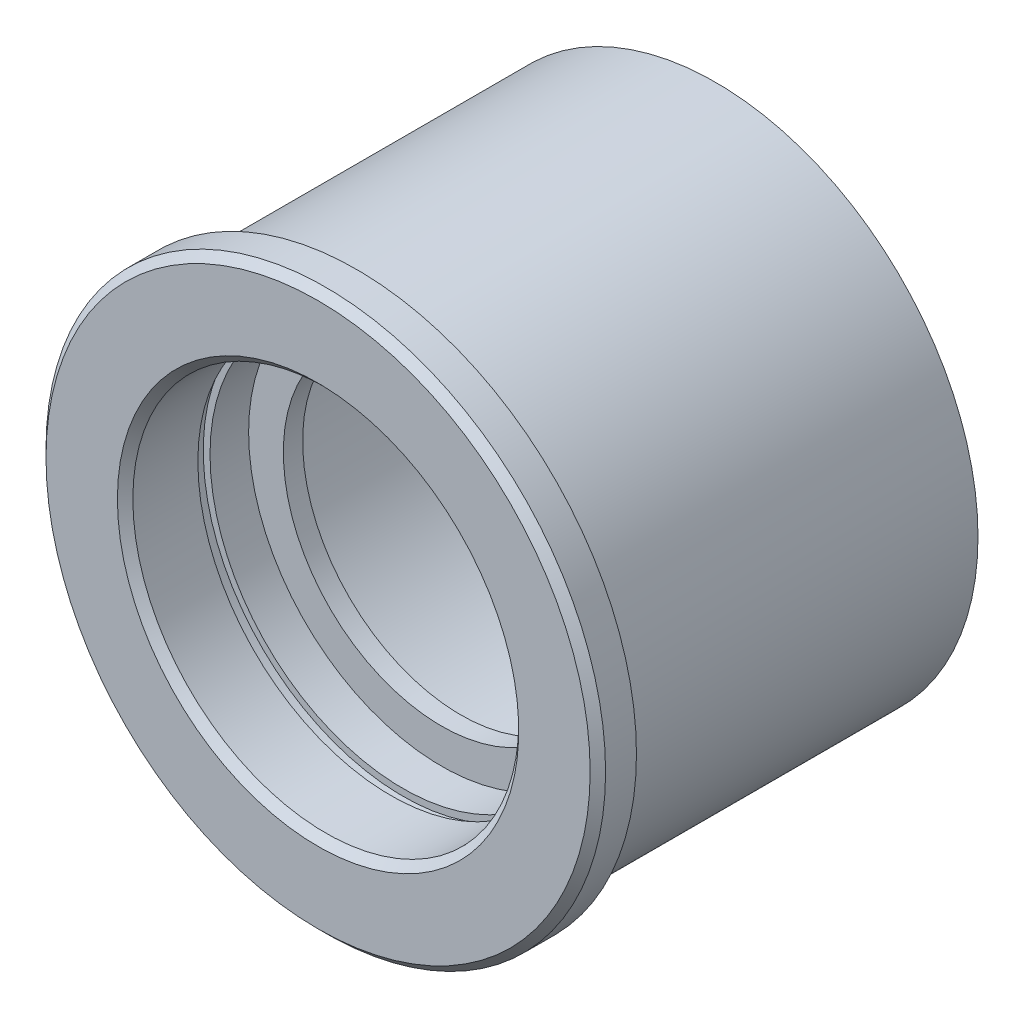
ISO-10303-21;
HEADER;
FILE_DESCRIPTION(('STEP AP214'),'2;1');
FILE_NAME('part.step','',(''),(''),'','','');
FILE_SCHEMA(('AUTOMOTIVE_DESIGN { 1 0 10303 214 1 1 1 1 }'));
ENDSEC;
DATA;
#1=APPLICATION_CONTEXT('core data for automotive mechanical design processes');
#2=APPLICATION_PROTOCOL_DEFINITION('international standard','automotive_design',2000,#1);
#3=PRODUCT_CONTEXT('',#1,'mechanical');
#4=PRODUCT('Part','Part','',(#3));
#5=PRODUCT_RELATED_PRODUCT_CATEGORY('part','',(#4));
#6=PRODUCT_DEFINITION_FORMATION('','',#4);
#7=PRODUCT_DEFINITION_CONTEXT('part definition',#1,'design');
#8=PRODUCT_DEFINITION('design','',#6,#7);
#9=PRODUCT_DEFINITION_SHAPE('','',#8);
#10=(LENGTH_UNIT() NAMED_UNIT(*) SI_UNIT(.MILLI.,.METRE.));
#11=(NAMED_UNIT(*) PLANE_ANGLE_UNIT() SI_UNIT($,.RADIAN.));
#12=(NAMED_UNIT(*) SI_UNIT($,.STERADIAN.) SOLID_ANGLE_UNIT());
#13=UNCERTAINTY_MEASURE_WITH_UNIT(LENGTH_MEASURE(1.E-05),#10,'distance_accuracy_value','');
#14=(GEOMETRIC_REPRESENTATION_CONTEXT(3) GLOBAL_UNCERTAINTY_ASSIGNED_CONTEXT((#13)) GLOBAL_UNIT_ASSIGNED_CONTEXT((#10,
#11,#12)) REPRESENTATION_CONTEXT('',''));
#15=CARTESIAN_POINT('',(0.,0.,0.));
#16=DIRECTION('',(0.,0.,1.));
#17=DIRECTION('',(1.,0.,0.));
#18=AXIS2_PLACEMENT_3D('',#15,#16,#17);
#19=CARTESIAN_POINT('',(0.,72.5,0.));
#20=DIRECTION('',(0.,0.,1.));
#21=DIRECTION('',(1.,0.,0.));
#22=AXIS2_PLACEMENT_3D('',#19,#20,#21);
#23=PLANE('',#22);
#24=CARTESIAN_POINT('',(0.,0.,0.));
#25=DIRECTION('',(0.,0.,1.));
#26=DIRECTION('',(1.,0.,0.));
#27=AXIS2_PLACEMENT_3D('',#24,#25,#26);
#28=CIRCLE('',#27,72.5);
#29=CARTESIAN_POINT('',(72.5,0.,0.));
#30=VERTEX_POINT('',#29);
#31=EDGE_CURVE('E70',#30,#30,#28,.T.);
#32=ORIENTED_EDGE('',*,*,#31,.F.);
#33=EDGE_LOOP('',(#32));
#34=FACE_BOUND('',#33,.T.);
#35=CARTESIAN_POINT('',(0.,0.,0.));
#36=DIRECTION('',(0.,0.,1.));
#37=DIRECTION('',(1.,0.,0.));
#38=AXIS2_PLACEMENT_3D('',#35,#36,#37);
#39=CIRCLE('',#38,68.);
#40=CARTESIAN_POINT('',(68.,0.,0.));
#41=VERTEX_POINT('',#40);
#42=EDGE_CURVE('E118',#41,#41,#39,.T.);
#43=ORIENTED_EDGE('',*,*,#42,.T.);
#44=EDGE_LOOP('',(#43));
#45=FACE_BOUND('',#44,.T.);
#46=ADVANCED_FACE('F43',(#34,#45),#23,.F.);
#47=CARTESIAN_POINT('',(0.,0.,0.));
#48=DIRECTION('',(0.,0.,1.));
#49=DIRECTION('',(1.,0.,0.));
#50=AXIS2_PLACEMENT_3D('',#47,#48,#49);
#51=CYLINDRICAL_SURFACE('',#50,72.5);
#52=CARTESIAN_POINT('',(0.,0.,8.00000000000003));
#53=DIRECTION('',(0.,0.,-1.));
#54=DIRECTION('',(-1.,0.,0.));
#55=AXIS2_PLACEMENT_3D('',#52,#53,#54);
#56=CIRCLE('',#55,72.5);
#57=CARTESIAN_POINT('',(-72.5,0.,8.00000000000003));
#58=VERTEX_POINT('',#57);
#59=EDGE_CURVE('E59',#58,#58,#56,.T.);
#60=ORIENTED_EDGE('',*,*,#59,.T.);
#61=EDGE_LOOP('',(#60));
#62=FACE_BOUND('',#61,.T.);
#63=ORIENTED_EDGE('',*,*,#31,.T.);
#64=EDGE_LOOP('',(#63));
#65=FACE_BOUND('',#64,.T.);
#66=ADVANCED_FACE('F141',(#62,#65),#51,.T.);
#67=CARTESIAN_POINT('',(0.,50.,10.));
#68=DIRECTION('',(0.,0.,-1.));
#69=DIRECTION('',(-1.,0.,0.));
#70=AXIS2_PLACEMENT_3D('',#67,#68,#69);
#71=PLANE('',#70);
#72=CARTESIAN_POINT('',(0.,0.,10.));
#73=DIRECTION('',(0.,0.,-1.));
#74=DIRECTION('',(-1.,0.,0.));
#75=AXIS2_PLACEMENT_3D('',#72,#73,#74);
#76=CIRCLE('',#75,70.5);
#77=CARTESIAN_POINT('',(-70.5,0.,10.));
#78=VERTEX_POINT('',#77);
#79=EDGE_CURVE('E64',#78,#78,#76,.F.);
#80=ORIENTED_EDGE('',*,*,#79,.T.);
#81=EDGE_LOOP('',(#80));
#82=FACE_BOUND('',#81,.T.);
#83=CARTESIAN_POINT('',(0.,0.,10.));
#84=DIRECTION('',(0.,0.,-1.));
#85=DIRECTION('',(-1.,0.,0.));
#86=AXIS2_PLACEMENT_3D('',#83,#84,#85);
#87=CIRCLE('',#86,52.);
#88=CARTESIAN_POINT('',(-52.,0.,10.));
#89=VERTEX_POINT('',#88);
#90=EDGE_CURVE('E67',#89,#89,#87,.T.);
#91=ORIENTED_EDGE('',*,*,#90,.T.);
#92=EDGE_LOOP('',(#91));
#93=FACE_BOUND('',#92,.T.);
#94=ADVANCED_FACE('F148',(#82,#93),#71,.F.);
#95=CARTESIAN_POINT('',(0.,0.,0.));
#96=DIRECTION('',(0.,0.,1.));
#97=DIRECTION('',(1.,0.,0.));
#98=AXIS2_PLACEMENT_3D('',#95,#96,#97);
#99=CYLINDRICAL_SURFACE('',#98,50.);
#100=CARTESIAN_POINT('',(0.,0.,7.99999999999995));
#101=DIRECTION('',(0.,0.,-1.));
#102=DIRECTION('',(-1.,0.,0.));
#103=AXIS2_PLACEMENT_3D('',#100,#101,#102);
#104=CIRCLE('',#103,50.);
#105=CARTESIAN_POINT('',(-50.,0.,7.99999999999995));
#106=VERTEX_POINT('',#105);
#107=EDGE_CURVE('E55',#106,#106,#104,.F.);
#108=ORIENTED_EDGE('',*,*,#107,.T.);
#109=EDGE_LOOP('',(#108));
#110=FACE_BOUND('',#109,.T.);
#111=CARTESIAN_POINT('',(0.,0.,-8.85));
#112=DIRECTION('',(0.,0.,1.));
#113=DIRECTION('',(1.,0.,0.));
#114=AXIS2_PLACEMENT_3D('',#111,#112,#113);
#115=CIRCLE('',#114,50.);
#116=CARTESIAN_POINT('',(50.,0.,-8.85));
#117=VERTEX_POINT('',#116);
#118=EDGE_CURVE('E73',#117,#117,#115,.T.);
#119=ORIENTED_EDGE('',*,*,#118,.F.);
#120=EDGE_LOOP('',(#119));
#121=FACE_BOUND('',#120,.T.);
#122=ADVANCED_FACE('F172',(#110,#121),#99,.F.);
#123=CARTESIAN_POINT('',(0.,50.,-8.85));
#124=DIRECTION('',(0.,0.,1.));
#125=DIRECTION('',(1.,0.,0.));
#126=AXIS2_PLACEMENT_3D('',#123,#124,#125);
#127=PLANE('',#126);
#128=CARTESIAN_POINT('',(0.,0.,-8.85));
#129=DIRECTION('',(0.,0.,1.));
#130=DIRECTION('',(1.,0.,0.));
#131=AXIS2_PLACEMENT_3D('',#128,#129,#130);
#132=CIRCLE('',#131,51.75);
#133=CARTESIAN_POINT('',(51.75,0.,-8.85));
#134=VERTEX_POINT('',#133);
#135=EDGE_CURVE('E76',#134,#134,#132,.T.);
#136=ORIENTED_EDGE('',*,*,#135,.F.);
#137=EDGE_LOOP('',(#136));
#138=FACE_BOUND('',#137,.T.);
#139=ORIENTED_EDGE('',*,*,#118,.T.);
#140=EDGE_LOOP('',(#139));
#141=FACE_BOUND('',#140,.T.);
#142=ADVANCED_FACE('F175',(#138,#141),#127,.F.);
#143=CARTESIAN_POINT('',(0.,0.,0.));
#144=DIRECTION('',(0.,0.,1.));
#145=DIRECTION('',(1.,0.,0.));
#146=AXIS2_PLACEMENT_3D('',#143,#144,#145);
#147=CYLINDRICAL_SURFACE('',#146,51.75);
#148=CARTESIAN_POINT('',(0.,0.,-12.));
#149=DIRECTION('',(0.,0.,1.));
#150=DIRECTION('',(1.,0.,0.));
#151=AXIS2_PLACEMENT_3D('',#148,#149,#150);
#152=CIRCLE('',#151,51.75);
#153=CARTESIAN_POINT('',(51.75,0.,-12.));
#154=VERTEX_POINT('',#153);
#155=EDGE_CURVE('E79',#154,#154,#152,.T.);
#156=ORIENTED_EDGE('',*,*,#155,.F.);
#157=EDGE_LOOP('',(#156));
#158=FACE_BOUND('',#157,.T.);
#159=ORIENTED_EDGE('',*,*,#135,.T.);
#160=EDGE_LOOP('',(#159));
#161=FACE_BOUND('',#160,.T.);
#162=ADVANCED_FACE('F179',(#158,#161),#147,.F.);
#163=CARTESIAN_POINT('',(0.,51.75,-12.));
#164=DIRECTION('',(0.,0.,-1.));
#165=DIRECTION('',(-1.,0.,0.));
#166=AXIS2_PLACEMENT_3D('',#163,#164,#165);
#167=PLANE('',#166);
#168=CARTESIAN_POINT('',(0.,0.,-12.));
#169=DIRECTION('',(0.,0.,1.));
#170=DIRECTION('',(1.,0.,0.));
#171=AXIS2_PLACEMENT_3D('',#168,#169,#170);
#172=CIRCLE('',#171,50.);
#173=CARTESIAN_POINT('',(50.,0.,-12.));
#174=VERTEX_POINT('',#173);
#175=EDGE_CURVE('E82',#174,#174,#172,.T.);
#176=ORIENTED_EDGE('',*,*,#175,.F.);
#177=EDGE_LOOP('',(#176));
#178=FACE_BOUND('',#177,.T.);
#179=ORIENTED_EDGE('',*,*,#155,.T.);
#180=EDGE_LOOP('',(#179));
#181=FACE_BOUND('',#180,.T.);
#182=ADVANCED_FACE('F185',(#178,#181),#167,.F.);
#183=CARTESIAN_POINT('',(0.,0.,0.));
#184=DIRECTION('',(0.,0.,1.));
#185=DIRECTION('',(1.,0.,0.));
#186=AXIS2_PLACEMENT_3D('',#183,#184,#185);
#187=CYLINDRICAL_SURFACE('',#186,50.);
#188=CARTESIAN_POINT('',(0.,0.,-22.));
#189=DIRECTION('',(0.,0.,1.));
#190=DIRECTION('',(1.,0.,0.));
#191=AXIS2_PLACEMENT_3D('',#188,#189,#190);
#192=CIRCLE('',#191,50.);
#193=CARTESIAN_POINT('',(50.,0.,-22.));
#194=VERTEX_POINT('',#193);
#195=EDGE_CURVE('E85',#194,#194,#192,.T.);
#196=ORIENTED_EDGE('',*,*,#195,.F.);
#197=EDGE_LOOP('',(#196));
#198=FACE_BOUND('',#197,.T.);
#199=ORIENTED_EDGE('',*,*,#175,.T.);
#200=EDGE_LOOP('',(#199));
#201=FACE_BOUND('',#200,.T.);
#202=ADVANCED_FACE('F315',(#198,#201),#187,.F.);
#203=CARTESIAN_POINT('',(0.,41.,-22.));
#204=DIRECTION('',(0.,0.,-1.));
#205=DIRECTION('',(-1.,0.,0.));
#206=AXIS2_PLACEMENT_3D('',#203,#204,#205);
#207=PLANE('',#206);
#208=CARTESIAN_POINT('',(0.,0.,-22.));
#209=DIRECTION('',(0.,0.,1.));
#210=DIRECTION('',(1.,0.,0.));
#211=AXIS2_PLACEMENT_3D('',#208,#209,#210);
#212=CIRCLE('',#211,41.);
#213=CARTESIAN_POINT('',(41.,0.,-22.));
#214=VERTEX_POINT('',#213);
#215=EDGE_CURVE('E88',#214,#214,#212,.T.);
#216=ORIENTED_EDGE('',*,*,#215,.F.);
#217=EDGE_LOOP('',(#216));
#218=FACE_BOUND('',#217,.T.);
#219=ORIENTED_EDGE('',*,*,#195,.T.);
#220=EDGE_LOOP('',(#219));
#221=FACE_BOUND('',#220,.T.);
#222=ADVANCED_FACE('F306',(#218,#221),#207,.F.);
#223=CARTESIAN_POINT('',(0.,0.,0.));
#224=DIRECTION('',(0.,0.,1.));
#225=DIRECTION('',(1.,0.,0.));
#226=AXIS2_PLACEMENT_3D('',#223,#224,#225);
#227=CYLINDRICAL_SURFACE('',#226,41.);
#228=CARTESIAN_POINT('',(0.,0.,-27.));
#229=DIRECTION('',(0.,0.,1.));
#230=DIRECTION('',(1.,0.,0.));
#231=AXIS2_PLACEMENT_3D('',#228,#229,#230);
#232=CIRCLE('',#231,41.);
#233=CARTESIAN_POINT('',(41.,0.,-27.));
#234=VERTEX_POINT('',#233);
#235=EDGE_CURVE('E91',#234,#234,#232,.T.);
#236=ORIENTED_EDGE('',*,*,#235,.F.);
#237=EDGE_LOOP('',(#236));
#238=FACE_BOUND('',#237,.T.);
#239=ORIENTED_EDGE('',*,*,#215,.T.);
#240=EDGE_LOOP('',(#239));
#241=FACE_BOUND('',#240,.T.);
#242=ADVANCED_FACE('F297',(#238,#241),#227,.F.);
#243=CARTESIAN_POINT('',(0.,41.,-27.));
#244=DIRECTION('',(0.,0.,1.));
#245=DIRECTION('',(1.,0.,0.));
#246=AXIS2_PLACEMENT_3D('',#243,#244,#245);
#247=PLANE('',#246);
#248=CARTESIAN_POINT('',(0.,0.,-27.));
#249=DIRECTION('',(0.,0.,1.));
#250=DIRECTION('',(1.,0.,0.));
#251=AXIS2_PLACEMENT_3D('',#248,#249,#250);
#252=CIRCLE('',#251,50.);
#253=CARTESIAN_POINT('',(50.,0.,-27.));
#254=VERTEX_POINT('',#253);
#255=EDGE_CURVE('E94',#254,#254,#252,.T.);
#256=ORIENTED_EDGE('',*,*,#255,.F.);
#257=EDGE_LOOP('',(#256));
#258=FACE_BOUND('',#257,.T.);
#259=ORIENTED_EDGE('',*,*,#235,.T.);
#260=EDGE_LOOP('',(#259));
#261=FACE_BOUND('',#260,.T.);
#262=ADVANCED_FACE('F288',(#258,#261),#247,.F.);
#263=CARTESIAN_POINT('',(0.,0.,0.));
#264=DIRECTION('',(0.,0.,1.));
#265=DIRECTION('',(1.,0.,0.));
#266=AXIS2_PLACEMENT_3D('',#263,#264,#265);
#267=CYLINDRICAL_SURFACE('',#266,50.);
#268=CARTESIAN_POINT('',(0.,0.,-30.));
#269=DIRECTION('',(0.,0.,1.));
#270=DIRECTION('',(1.,0.,0.));
#271=AXIS2_PLACEMENT_3D('',#268,#269,#270);
#272=CIRCLE('',#271,50.);
#273=CARTESIAN_POINT('',(50.,0.,-30.));
#274=VERTEX_POINT('',#273);
#275=EDGE_CURVE('E97',#274,#274,#272,.T.);
#276=ORIENTED_EDGE('',*,*,#275,.F.);
#277=EDGE_LOOP('',(#276));
#278=FACE_BOUND('',#277,.T.);
#279=ORIENTED_EDGE('',*,*,#255,.T.);
#280=EDGE_LOOP('',(#279));
#281=FACE_BOUND('',#280,.T.);
#282=ADVANCED_FACE('F279',(#278,#281),#267,.F.);
#283=CARTESIAN_POINT('',(0.,50.,-30.));
#284=DIRECTION('',(0.,0.,1.));
#285=DIRECTION('',(1.,0.,0.));
#286=AXIS2_PLACEMENT_3D('',#283,#284,#285);
#287=PLANE('',#286);
#288=CARTESIAN_POINT('',(0.,0.,-30.));
#289=DIRECTION('',(0.,0.,1.));
#290=DIRECTION('',(1.,0.,0.));
#291=AXIS2_PLACEMENT_3D('',#288,#289,#290);
#292=CIRCLE('',#291,60.);
#293=CARTESIAN_POINT('',(60.,0.,-30.));
#294=VERTEX_POINT('',#293);
#295=EDGE_CURVE('E100',#294,#294,#292,.T.);
#296=ORIENTED_EDGE('',*,*,#295,.F.);
#297=EDGE_LOOP('',(#296));
#298=FACE_BOUND('',#297,.T.);
#299=ORIENTED_EDGE('',*,*,#275,.T.);
#300=EDGE_LOOP('',(#299));
#301=FACE_BOUND('',#300,.T.);
#302=ADVANCED_FACE('F270',(#298,#301),#287,.F.);
#303=CARTESIAN_POINT('',(0.,0.,0.));
#304=DIRECTION('',(0.,0.,1.));
#305=DIRECTION('',(1.,0.,0.));
#306=AXIS2_PLACEMENT_3D('',#303,#304,#305);
#307=CYLINDRICAL_SURFACE('',#306,60.);
#308=CARTESIAN_POINT('',(0.,0.,-79.));
#309=DIRECTION('',(0.,0.,1.));
#310=DIRECTION('',(1.,0.,0.));
#311=AXIS2_PLACEMENT_3D('',#308,#309,#310);
#312=CIRCLE('',#311,60.);
#313=CARTESIAN_POINT('',(60.,0.,-79.));
#314=VERTEX_POINT('',#313);
#315=EDGE_CURVE('E103',#314,#314,#312,.T.);
#316=ORIENTED_EDGE('',*,*,#315,.F.);
#317=EDGE_LOOP('',(#316));
#318=FACE_BOUND('',#317,.T.);
#319=ORIENTED_EDGE('',*,*,#295,.T.);
#320=EDGE_LOOP('',(#319));
#321=FACE_BOUND('',#320,.T.);
#322=ADVANCED_FACE('F261',(#318,#321),#307,.F.);
#323=CARTESIAN_POINT('',(0.,60.,-79.));
#324=DIRECTION('',(0.,0.,1.));
#325=DIRECTION('',(1.,0.,0.));
#326=AXIS2_PLACEMENT_3D('',#323,#324,#325);
#327=PLANE('',#326);
#328=CARTESIAN_POINT('',(0.,0.,-79.));
#329=DIRECTION('',(0.,0.,1.));
#330=DIRECTION('',(1.,0.,0.));
#331=AXIS2_PLACEMENT_3D('',#328,#329,#330);
#332=CIRCLE('',#331,62.);
#333=CARTESIAN_POINT('',(62.,0.,-79.));
#334=VERTEX_POINT('',#333);
#335=EDGE_CURVE('E106',#334,#334,#332,.T.);
#336=ORIENTED_EDGE('',*,*,#335,.F.);
#337=EDGE_LOOP('',(#336));
#338=FACE_BOUND('',#337,.T.);
#339=ORIENTED_EDGE('',*,*,#315,.T.);
#340=EDGE_LOOP('',(#339));
#341=FACE_BOUND('',#340,.T.);
#342=ADVANCED_FACE('F252',(#338,#341),#327,.F.);
#343=CARTESIAN_POINT('',(0.,0.,0.));
#344=DIRECTION('',(0.,0.,1.));
#345=DIRECTION('',(1.,0.,0.));
#346=AXIS2_PLACEMENT_3D('',#343,#344,#345);
#347=CYLINDRICAL_SURFACE('',#346,62.);
#348=CARTESIAN_POINT('',(0.,0.,-83.15));
#349=DIRECTION('',(0.,0.,1.));
#350=DIRECTION('',(1.,0.,0.));
#351=AXIS2_PLACEMENT_3D('',#348,#349,#350);
#352=CIRCLE('',#351,62.);
#353=CARTESIAN_POINT('',(62.,0.,-83.15));
#354=VERTEX_POINT('',#353);
#355=EDGE_CURVE('E109',#354,#354,#352,.T.);
#356=ORIENTED_EDGE('',*,*,#355,.F.);
#357=EDGE_LOOP('',(#356));
#358=FACE_BOUND('',#357,.T.);
#359=ORIENTED_EDGE('',*,*,#335,.T.);
#360=EDGE_LOOP('',(#359));
#361=FACE_BOUND('',#360,.T.);
#362=ADVANCED_FACE('F247',(#358,#361),#347,.F.);
#363=CARTESIAN_POINT('',(0.,62.,-83.15));
#364=DIRECTION('',(0.,0.,-1.));
#365=DIRECTION('',(-1.,0.,0.));
#366=AXIS2_PLACEMENT_3D('',#363,#364,#365);
#367=PLANE('',#366);
#368=CARTESIAN_POINT('',(0.,0.,-83.15));
#369=DIRECTION('',(0.,0.,1.));
#370=DIRECTION('',(1.,0.,0.));
#371=AXIS2_PLACEMENT_3D('',#368,#369,#370);
#372=CIRCLE('',#371,60.);
#373=CARTESIAN_POINT('',(60.,0.,-83.15));
#374=VERTEX_POINT('',#373);
#375=EDGE_CURVE('E112',#374,#374,#372,.T.);
#376=ORIENTED_EDGE('',*,*,#375,.F.);
#377=EDGE_LOOP('',(#376));
#378=FACE_BOUND('',#377,.T.);
#379=ORIENTED_EDGE('',*,*,#355,.T.);
#380=EDGE_LOOP('',(#379));
#381=FACE_BOUND('',#380,.T.);
#382=ADVANCED_FACE('F138',(#378,#381),#367,.F.);
#383=CARTESIAN_POINT('',(0.,0.,0.));
#384=DIRECTION('',(0.,0.,1.));
#385=DIRECTION('',(1.,0.,0.));
#386=AXIS2_PLACEMENT_3D('',#383,#384,#385);
#387=CYLINDRICAL_SURFACE('',#386,60.);
#388=CARTESIAN_POINT('',(0.,0.,-91.));
#389=DIRECTION('',(0.,0.,1.));
#390=DIRECTION('',(1.,0.,0.));
#391=AXIS2_PLACEMENT_3D('',#388,#389,#390);
#392=CIRCLE('',#391,60.);
#393=CARTESIAN_POINT('',(60.,0.,-91.));
#394=VERTEX_POINT('',#393);
#395=EDGE_CURVE('E10',#394,#394,#392,.F.);
#396=ORIENTED_EDGE('',*,*,#395,.T.);
#397=EDGE_LOOP('',(#396));
#398=FACE_BOUND('',#397,.T.);
#399=ORIENTED_EDGE('',*,*,#375,.T.);
#400=EDGE_LOOP('',(#399));
#401=FACE_BOUND('',#400,.T.);
#402=ADVANCED_FACE('F132',(#398,#401),#387,.F.);
#403=CARTESIAN_POINT('',(0.,68.,-93.));
#404=DIRECTION('',(0.,0.,1.));
#405=DIRECTION('',(1.,0.,0.));
#406=AXIS2_PLACEMENT_3D('',#403,#404,#405);
#407=PLANE('',#406);
#408=CARTESIAN_POINT('',(0.,0.,-93.));
#409=DIRECTION('',(0.,0.,1.));
#410=DIRECTION('',(1.,0.,0.));
#411=AXIS2_PLACEMENT_3D('',#408,#409,#410);
#412=CIRCLE('',#411,62.);
#413=CARTESIAN_POINT('',(62.,0.,-93.));
#414=VERTEX_POINT('',#413);
#415=EDGE_CURVE('E51',#414,#414,#412,.T.);
#416=ORIENTED_EDGE('',*,*,#415,.T.);
#417=EDGE_LOOP('',(#416));
#418=FACE_BOUND('',#417,.T.);
#419=CARTESIAN_POINT('',(0.,0.,-93.));
#420=DIRECTION('',(0.,0.,1.));
#421=DIRECTION('',(1.,0.,0.));
#422=AXIS2_PLACEMENT_3D('',#419,#420,#421);
#423=CIRCLE('',#422,68.);
#424=CARTESIAN_POINT('',(68.,0.,-93.));
#425=VERTEX_POINT('',#424);
#426=EDGE_CURVE('E115',#425,#425,#423,.T.);
#427=ORIENTED_EDGE('',*,*,#426,.F.);
#428=EDGE_LOOP('',(#427));
#429=FACE_BOUND('',#428,.T.);
#430=ADVANCED_FACE('F127',(#418,#429),#407,.F.);
#431=CARTESIAN_POINT('',(0.,0.,0.));
#432=DIRECTION('',(0.,0.,1.));
#433=DIRECTION('',(1.,0.,0.));
#434=AXIS2_PLACEMENT_3D('',#431,#432,#433);
#435=CYLINDRICAL_SURFACE('',#434,68.);
#436=ORIENTED_EDGE('',*,*,#42,.F.);
#437=EDGE_LOOP('',(#436));
#438=FACE_BOUND('',#437,.T.);
#439=ORIENTED_EDGE('',*,*,#426,.T.);
#440=EDGE_LOOP('',(#439));
#441=FACE_BOUND('',#440,.T.);
#442=ADVANCED_FACE('F123',(#438,#441),#435,.T.);
#443=CARTESIAN_POINT('',(0.,0.,10.));
#444=DIRECTION('',(0.,0.,-1.));
#445=DIRECTION('',(-1.,0.,0.));
#446=AXIS2_PLACEMENT_3D('',#443,#444,#445);
#447=CONICAL_SURFACE('',#446,70.5,0.785398163397448);
#448=ORIENTED_EDGE('',*,*,#59,.F.);
#449=EDGE_LOOP('',(#448));
#450=FACE_BOUND('',#449,.T.);
#451=ORIENTED_EDGE('',*,*,#79,.F.);
#452=EDGE_LOOP('',(#451));
#453=FACE_BOUND('',#452,.T.);
#454=ADVANCED_FACE('F126',(#450,#453),#447,.T.);
#455=CARTESIAN_POINT('',(0.,0.,7.99999999999995));
#456=DIRECTION('',(0.,0.,1.));
#457=DIRECTION('',(1.,0.,0.));
#458=AXIS2_PLACEMENT_3D('',#455,#456,#457);
#459=CONICAL_SURFACE('',#458,50.,0.785398163397447);
#460=ORIENTED_EDGE('',*,*,#90,.F.);
#461=EDGE_LOOP('',(#460));
#462=FACE_BOUND('',#461,.T.);
#463=ORIENTED_EDGE('',*,*,#107,.F.);
#464=EDGE_LOOP('',(#463));
#465=FACE_BOUND('',#464,.T.);
#466=ADVANCED_FACE('F158',(#462,#465),#459,.F.);
#467=CARTESIAN_POINT('',(0.,0.,-93.));
#468=DIRECTION('',(0.,0.,-1.));
#469=DIRECTION('',(-1.,0.,0.));
#470=AXIS2_PLACEMENT_3D('',#467,#468,#469);
#471=CONICAL_SURFACE('',#470,62.,0.785398163397448);
#472=ORIENTED_EDGE('',*,*,#395,.F.);
#473=EDGE_LOOP('',(#472));
#474=FACE_BOUND('',#473,.T.);
#475=ORIENTED_EDGE('',*,*,#415,.F.);
#476=EDGE_LOOP('',(#475));
#477=FACE_BOUND('',#476,.T.);
#478=ADVANCED_FACE('F46',(#474,#477),#471,.F.);
#479=CLOSED_SHELL('',(#46,#66,#94,#122,#142,#162,#182,#202,#222,#242,#262,#282,#302,#322,#342,
#362,#382,#402,#430,#442,#454,#466,#478));
#480=MANIFOLD_SOLID_BREP('B2',#479);
#481=ADVANCED_BREP_SHAPE_REPRESENTATION('',(#18,#480),#14);
#482=SHAPE_DEFINITION_REPRESENTATION(#9,#481);
ENDSEC;
END-ISO-10303-21;
